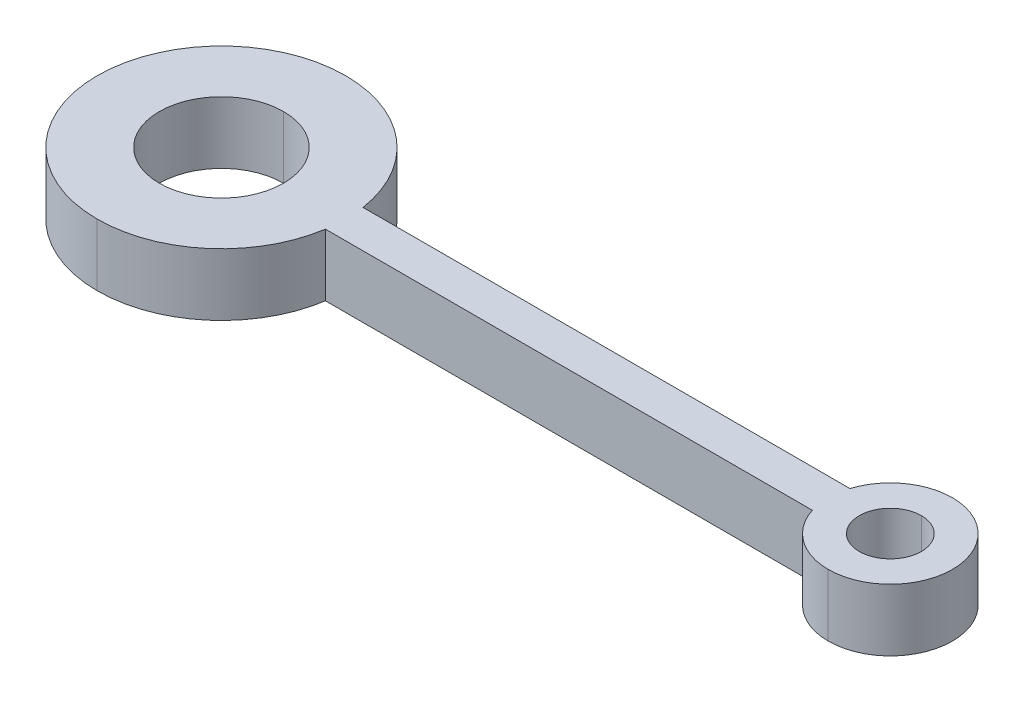
ISO-10303-21;
HEADER;
FILE_DESCRIPTION(('STEP AP214'),'2;1');
FILE_NAME('part.step','',(''),(''),'','','');
FILE_SCHEMA(('AUTOMOTIVE_DESIGN { 1 0 10303 214 1 1 1 1 }'));
ENDSEC;
DATA;
#1=APPLICATION_CONTEXT('core data for automotive mechanical design processes');
#2=APPLICATION_PROTOCOL_DEFINITION('international standard','automotive_design',2000,#1);
#3=PRODUCT_CONTEXT('',#1,'mechanical');
#4=PRODUCT('Part','Part','',(#3));
#5=PRODUCT_RELATED_PRODUCT_CATEGORY('part','',(#4));
#6=PRODUCT_DEFINITION_FORMATION('','',#4);
#7=PRODUCT_DEFINITION_CONTEXT('part definition',#1,'design');
#8=PRODUCT_DEFINITION('design','',#6,#7);
#9=PRODUCT_DEFINITION_SHAPE('','',#8);
#10=(LENGTH_UNIT() NAMED_UNIT(*) SI_UNIT(.MILLI.,.METRE.));
#11=(NAMED_UNIT(*) PLANE_ANGLE_UNIT() SI_UNIT($,.RADIAN.));
#12=(NAMED_UNIT(*) SI_UNIT($,.STERADIAN.) SOLID_ANGLE_UNIT());
#13=UNCERTAINTY_MEASURE_WITH_UNIT(LENGTH_MEASURE(1.E-05),#10,'distance_accuracy_value','');
#14=(GEOMETRIC_REPRESENTATION_CONTEXT(3) GLOBAL_UNCERTAINTY_ASSIGNED_CONTEXT((#13)) GLOBAL_UNIT_ASSIGNED_CONTEXT((#10,
#11,#12)) REPRESENTATION_CONTEXT('',''));
#15=CARTESIAN_POINT('',(0.,0.,0.));
#16=DIRECTION('',(0.,0.,1.));
#17=DIRECTION('',(1.,0.,0.));
#18=AXIS2_PLACEMENT_3D('',#15,#16,#17);
#19=CARTESIAN_POINT('',(121.827839248125,25.,0.));
#20=DIRECTION('',(0.,-1.,0.));
#21=DIRECTION('',(0.,0.,-1.));
#22=AXIS2_PLACEMENT_3D('',#19,#20,#21);
#23=CYLINDRICAL_SURFACE('',#22,25.);
#24=CARTESIAN_POINT('',(121.827839248125,25.,0.));
#25=DIRECTION('',(0.,1.,0.));
#26=DIRECTION('',(0.,0.,1.));
#27=AXIS2_PLACEMENT_3D('',#24,#25,#26);
#28=CIRCLE('',#27,25.);
#29=CARTESIAN_POINT('',(121.827839248125,25.,25.));
#30=VERTEX_POINT('',#29);
#31=CARTESIAN_POINT('',(121.827839248125,25.,-25.));
#32=VERTEX_POINT('',#31);
#33=EDGE_CURVE('E119',#30,#32,#28,.T.);
#34=ORIENTED_EDGE('',*,*,#33,.F.);
#35=DIRECTION('',(0.,-1.,0.));
#36=VECTOR('',#35,1.);
#37=CARTESIAN_POINT('',(121.827839248125,25.,25.));
#38=LINE('',#37,#36);
#39=CARTESIAN_POINT('',(121.827839248125,0.,25.));
#40=VERTEX_POINT('',#39);
#41=EDGE_CURVE('E179',#30,#40,#38,.T.);
#42=ORIENTED_EDGE('',*,*,#41,.T.);
#43=CARTESIAN_POINT('',(121.827839248125,0.,0.));
#44=DIRECTION('',(0.,1.,0.));
#45=DIRECTION('',(0.,0.,1.));
#46=AXIS2_PLACEMENT_3D('',#43,#44,#45);
#47=CIRCLE('',#46,25.);
#48=CARTESIAN_POINT('',(121.827839248125,0.,-25.));
#49=VERTEX_POINT('',#48);
#50=EDGE_CURVE('E122',#40,#49,#47,.T.);
#51=ORIENTED_EDGE('',*,*,#50,.T.);
#52=DIRECTION('',(0.,-1.,0.));
#53=VECTOR('',#52,1.);
#54=CARTESIAN_POINT('',(121.827839248125,25.,-25.));
#55=LINE('',#54,#53);
#56=EDGE_CURVE('E10',#32,#49,#55,.T.);
#57=ORIENTED_EDGE('',*,*,#56,.F.);
#58=EDGE_LOOP('',(#34,#42,#51,#57));
#59=FACE_BOUND('',#58,.T.);
#60=ADVANCED_FACE('F16',(#59),#23,.T.);
#61=CARTESIAN_POINT('',(121.827839248125,25.,0.));
#62=DIRECTION('',(0.,-1.,0.));
#63=DIRECTION('',(0.,0.,-1.));
#64=AXIS2_PLACEMENT_3D('',#61,#62,#63);
#65=CYLINDRICAL_SURFACE('',#64,25.);
#66=CARTESIAN_POINT('',(121.827839248125,25.,0.));
#67=DIRECTION('',(0.,1.,0.));
#68=DIRECTION('',(0.,0.,1.));
#69=AXIS2_PLACEMENT_3D('',#66,#67,#68);
#70=CIRCLE('',#69,25.);
#71=CARTESIAN_POINT('',(98.,25.,-7.56532066508318));
#72=VERTEX_POINT('',#71);
#73=EDGE_CURVE('E127',#32,#72,#70,.T.);
#74=ORIENTED_EDGE('',*,*,#73,.F.);
#75=ORIENTED_EDGE('',*,*,#56,.T.);
#76=CARTESIAN_POINT('',(121.827839248125,0.,0.));
#77=DIRECTION('',(0.,1.,0.));
#78=DIRECTION('',(0.,0.,1.));
#79=AXIS2_PLACEMENT_3D('',#76,#77,#78);
#80=CIRCLE('',#79,25.);
#81=CARTESIAN_POINT('',(98.,0.,-7.56532066508318));
#82=VERTEX_POINT('',#81);
#83=EDGE_CURVE('E163',#49,#82,#80,.T.);
#84=ORIENTED_EDGE('',*,*,#83,.T.);
#85=DIRECTION('',(0.,-1.,0.));
#86=VECTOR('',#85,1.);
#87=CARTESIAN_POINT('',(98.,25.,-7.56532066508318));
#88=LINE('',#87,#86);
#89=EDGE_CURVE('E129',#72,#82,#88,.T.);
#90=ORIENTED_EDGE('',*,*,#89,.F.);
#91=EDGE_LOOP('',(#74,#75,#84,#90));
#92=FACE_BOUND('',#91,.T.);
#93=ADVANCED_FACE('F128',(#92),#65,.T.);
#94=CARTESIAN_POINT('',(121.827839248125,25.,0.));
#95=DIRECTION('',(0.,-1.,0.));
#96=DIRECTION('',(0.,0.,-1.));
#97=AXIS2_PLACEMENT_3D('',#94,#95,#96);
#98=CYLINDRICAL_SURFACE('',#97,12.5);
#99=CARTESIAN_POINT('',(121.827839248125,25.,0.));
#100=DIRECTION('',(0.,1.,0.));
#101=DIRECTION('',(0.,0.,1.));
#102=AXIS2_PLACEMENT_3D('',#99,#100,#101);
#103=CIRCLE('',#102,12.5);
#104=CARTESIAN_POINT('',(121.827839248125,25.,-12.5));
#105=VERTEX_POINT('',#104);
#106=CARTESIAN_POINT('',(121.827839248125,25.,12.5));
#107=VERTEX_POINT('',#106);
#108=EDGE_CURVE('E201',#105,#107,#103,.T.);
#109=ORIENTED_EDGE('',*,*,#108,.T.);
#110=DIRECTION('',(0.,-1.,0.));
#111=VECTOR('',#110,1.);
#112=CARTESIAN_POINT('',(121.827839248125,25.,12.5));
#113=LINE('',#112,#111);
#114=CARTESIAN_POINT('',(121.827839248125,0.,12.5));
#115=VERTEX_POINT('',#114);
#116=EDGE_CURVE('E207',#107,#115,#113,.T.);
#117=ORIENTED_EDGE('',*,*,#116,.T.);
#118=CARTESIAN_POINT('',(121.827839248125,0.,0.));
#119=DIRECTION('',(0.,1.,0.));
#120=DIRECTION('',(0.,0.,1.));
#121=AXIS2_PLACEMENT_3D('',#118,#119,#120);
#122=CIRCLE('',#121,12.5);
#123=CARTESIAN_POINT('',(121.827839248125,0.,-12.5));
#124=VERTEX_POINT('',#123);
#125=EDGE_CURVE('E186',#124,#115,#122,.T.);
#126=ORIENTED_EDGE('',*,*,#125,.F.);
#127=DIRECTION('',(0.,-1.,0.));
#128=VECTOR('',#127,1.);
#129=CARTESIAN_POINT('',(121.827839248125,25.,-12.5));
#130=LINE('',#129,#128);
#131=EDGE_CURVE('E182',#105,#124,#130,.T.);
#132=ORIENTED_EDGE('',*,*,#131,.F.);
#133=EDGE_LOOP('',(#109,#117,#126,#132));
#134=FACE_BOUND('',#133,.T.);
#135=ADVANCED_FACE('F312',(#134),#98,.F.);
#136=CARTESIAN_POINT('',(-147.424345450743,25.,0.));
#137=DIRECTION('',(0.,-1.,0.));
#138=DIRECTION('',(0.,0.,-1.));
#139=AXIS2_PLACEMENT_3D('',#136,#137,#138);
#140=CYLINDRICAL_SURFACE('',#139,50.);
#141=CARTESIAN_POINT('',(-147.424345450743,25.,0.));
#142=DIRECTION('',(0.,1.,0.));
#143=DIRECTION('',(0.,0.,1.));
#144=AXIS2_PLACEMENT_3D('',#141,#142,#143);
#145=CIRCLE('',#144,50.);
#146=CARTESIAN_POINT('',(-147.424345450743,25.,50.));
#147=VERTEX_POINT('',#146);
#148=CARTESIAN_POINT('',(-98.,25.,7.56532066508318));
#149=VERTEX_POINT('',#148);
#150=EDGE_CURVE('E185',#147,#149,#145,.T.);
#151=ORIENTED_EDGE('',*,*,#150,.F.);
#152=DIRECTION('',(0.,-1.,0.));
#153=VECTOR('',#152,1.);
#154=CARTESIAN_POINT('',(-147.424345450743,25.,50.));
#155=LINE('',#154,#153);
#156=CARTESIAN_POINT('',(-147.424345450743,0.,50.));
#157=VERTEX_POINT('',#156);
#158=EDGE_CURVE('E27',#147,#157,#155,.T.);
#159=ORIENTED_EDGE('',*,*,#158,.T.);
#160=CARTESIAN_POINT('',(-147.424345450743,0.,0.));
#161=DIRECTION('',(0.,1.,0.));
#162=DIRECTION('',(0.,0.,1.));
#163=AXIS2_PLACEMENT_3D('',#160,#161,#162);
#164=CIRCLE('',#163,50.);
#165=CARTESIAN_POINT('',(-98.,0.,7.56532066508318));
#166=VERTEX_POINT('',#165);
#167=EDGE_CURVE('E176',#157,#166,#164,.T.);
#168=ORIENTED_EDGE('',*,*,#167,.T.);
#169=DIRECTION('',(0.,-1.,0.));
#170=VECTOR('',#169,1.);
#171=CARTESIAN_POINT('',(-98.,25.,7.56532066508318));
#172=LINE('',#171,#170);
#173=EDGE_CURVE('E236',#149,#166,#172,.T.);
#174=ORIENTED_EDGE('',*,*,#173,.F.);
#175=EDGE_LOOP('',(#151,#159,#168,#174));
#176=FACE_BOUND('',#175,.T.);
#177=ADVANCED_FACE('F272',(#176),#140,.T.);
#178=CARTESIAN_POINT('',(-147.424345450743,25.,0.));
#179=DIRECTION('',(0.,-1.,0.));
#180=DIRECTION('',(0.,0.,-1.));
#181=AXIS2_PLACEMENT_3D('',#178,#179,#180);
#182=CYLINDRICAL_SURFACE('',#181,50.);
#183=ORIENTED_EDGE('',*,*,#158,.F.);
#184=CARTESIAN_POINT('',(-147.424345450743,25.,0.));
#185=DIRECTION('',(0.,1.,0.));
#186=DIRECTION('',(0.,0.,1.));
#187=AXIS2_PLACEMENT_3D('',#184,#185,#186);
#188=CIRCLE('',#187,50.);
#189=CARTESIAN_POINT('',(-147.424345450743,25.,-50.));
#190=VERTEX_POINT('',#189);
#191=EDGE_CURVE('E215',#190,#147,#188,.T.);
#192=ORIENTED_EDGE('',*,*,#191,.F.);
#193=DIRECTION('',(0.,-1.,0.));
#194=VECTOR('',#193,1.);
#195=CARTESIAN_POINT('',(-147.424345450743,25.,-50.));
#196=LINE('',#195,#194);
#197=CARTESIAN_POINT('',(-147.424345450743,0.,-50.));
#198=VERTEX_POINT('',#197);
#199=EDGE_CURVE('E195',#190,#198,#196,.T.);
#200=ORIENTED_EDGE('',*,*,#199,.T.);
#201=CARTESIAN_POINT('',(-147.424345450743,0.,0.));
#202=DIRECTION('',(0.,1.,0.));
#203=DIRECTION('',(0.,0.,1.));
#204=AXIS2_PLACEMENT_3D('',#201,#202,#203);
#205=CIRCLE('',#204,50.);
#206=EDGE_CURVE('E190',#198,#157,#205,.T.);
#207=ORIENTED_EDGE('',*,*,#206,.T.);
#208=EDGE_LOOP('',(#183,#192,#200,#207));
#209=FACE_BOUND('',#208,.T.);
#210=ADVANCED_FACE('F18',(#209),#182,.T.);
#211=CARTESIAN_POINT('',(-147.424345450743,25.,0.));
#212=DIRECTION('',(0.,-1.,0.));
#213=DIRECTION('',(0.,0.,-1.));
#214=AXIS2_PLACEMENT_3D('',#211,#212,#213);
#215=CYLINDRICAL_SURFACE('',#214,25.);
#216=CARTESIAN_POINT('',(-147.424345450743,25.,0.));
#217=DIRECTION('',(0.,1.,0.));
#218=DIRECTION('',(0.,0.,1.));
#219=AXIS2_PLACEMENT_3D('',#216,#217,#218);
#220=CIRCLE('',#219,25.);
#221=CARTESIAN_POINT('',(-147.424345450743,25.,-25.));
#222=VERTEX_POINT('',#221);
#223=CARTESIAN_POINT('',(-147.424345450743,25.,25.));
#224=VERTEX_POINT('',#223);
#225=EDGE_CURVE('E243',#222,#224,#220,.T.);
#226=ORIENTED_EDGE('',*,*,#225,.T.);
#227=DIRECTION('',(0.,-1.,0.));
#228=VECTOR('',#227,1.);
#229=CARTESIAN_POINT('',(-147.424345450743,25.,25.));
#230=LINE('',#229,#228);
#231=CARTESIAN_POINT('',(-147.424345450743,0.,25.));
#232=VERTEX_POINT('',#231);
#233=EDGE_CURVE('E42',#224,#232,#230,.T.);
#234=ORIENTED_EDGE('',*,*,#233,.T.);
#235=CARTESIAN_POINT('',(-147.424345450743,0.,0.));
#236=DIRECTION('',(0.,1.,0.));
#237=DIRECTION('',(0.,0.,1.));
#238=AXIS2_PLACEMENT_3D('',#235,#236,#237);
#239=CIRCLE('',#238,25.);
#240=CARTESIAN_POINT('',(-147.424345450743,0.,-25.));
#241=VERTEX_POINT('',#240);
#242=EDGE_CURVE('E154',#241,#232,#239,.T.);
#243=ORIENTED_EDGE('',*,*,#242,.F.);
#244=DIRECTION('',(0.,-1.,0.));
#245=VECTOR('',#244,1.);
#246=CARTESIAN_POINT('',(-147.424345450743,25.,-25.));
#247=LINE('',#246,#245);
#248=EDGE_CURVE('E152',#222,#241,#247,.T.);
#249=ORIENTED_EDGE('',*,*,#248,.F.);
#250=EDGE_LOOP('',(#226,#234,#243,#249));
#251=FACE_BOUND('',#250,.T.);
#252=ADVANCED_FACE('F344',(#251),#215,.F.);
#253=CARTESIAN_POINT('',(0.,25.,-7.56532066508318));
#254=DIRECTION('',(0.,0.,-1.));
#255=DIRECTION('',(0.,-1.,0.));
#256=AXIS2_PLACEMENT_3D('',#253,#254,#255);
#257=PLANE('',#256);
#258=DIRECTION('',(1.,0.,0.));
#259=VECTOR('',#258,1.);
#260=CARTESIAN_POINT('',(0.,0.,-7.56532066508318));
#261=LINE('',#260,#259);
#262=CARTESIAN_POINT('',(-98.,0.,-7.56532066508318));
#263=VERTEX_POINT('',#262);
#264=EDGE_CURVE('E20',#263,#82,#261,.T.);
#265=ORIENTED_EDGE('',*,*,#264,.F.);
#266=DIRECTION('',(0.,-1.,0.));
#267=VECTOR('',#266,1.);
#268=CARTESIAN_POINT('',(-98.,25.,-7.56532066508318));
#269=LINE('',#268,#267);
#270=CARTESIAN_POINT('',(-98.,25.,-7.56532066508318));
#271=VERTEX_POINT('',#270);
#272=EDGE_CURVE('E168',#271,#263,#269,.T.);
#273=ORIENTED_EDGE('',*,*,#272,.F.);
#274=DIRECTION('',(1.,0.,0.));
#275=VECTOR('',#274,1.);
#276=CARTESIAN_POINT('',(0.,25.,-7.56532066508318));
#277=LINE('',#276,#275);
#278=EDGE_CURVE('E134',#271,#72,#277,.T.);
#279=ORIENTED_EDGE('',*,*,#278,.T.);
#280=ORIENTED_EDGE('',*,*,#89,.T.);
#281=EDGE_LOOP('',(#265,#273,#279,#280));
#282=FACE_BOUND('',#281,.T.);
#283=ADVANCED_FACE('F349',(#282),#257,.T.);
#284=CARTESIAN_POINT('',(121.827839248125,25.,0.));
#285=DIRECTION('',(0.,-1.,0.));
#286=DIRECTION('',(0.,0.,-1.));
#287=AXIS2_PLACEMENT_3D('',#284,#285,#286);
#288=CYLINDRICAL_SURFACE('',#287,25.);
#289=ORIENTED_EDGE('',*,*,#41,.F.);
#290=CARTESIAN_POINT('',(121.827839248125,25.,0.));
#291=DIRECTION('',(0.,1.,0.));
#292=DIRECTION('',(0.,0.,1.));
#293=AXIS2_PLACEMENT_3D('',#290,#291,#292);
#294=CIRCLE('',#293,25.);
#295=CARTESIAN_POINT('',(98.,25.,7.56532066508318));
#296=VERTEX_POINT('',#295);
#297=EDGE_CURVE('E140',#296,#30,#294,.T.);
#298=ORIENTED_EDGE('',*,*,#297,.F.);
#299=DIRECTION('',(0.,-1.,0.));
#300=VECTOR('',#299,1.);
#301=CARTESIAN_POINT('',(98.,25.,7.56532066508318));
#302=LINE('',#301,#300);
#303=CARTESIAN_POINT('',(98.,0.,7.56532066508318));
#304=VERTEX_POINT('',#303);
#305=EDGE_CURVE('E234',#296,#304,#302,.T.);
#306=ORIENTED_EDGE('',*,*,#305,.T.);
#307=CARTESIAN_POINT('',(121.827839248125,0.,0.));
#308=DIRECTION('',(0.,1.,0.));
#309=DIRECTION('',(0.,0.,1.));
#310=AXIS2_PLACEMENT_3D('',#307,#308,#309);
#311=CIRCLE('',#310,25.);
#312=EDGE_CURVE('E177',#304,#40,#311,.T.);
#313=ORIENTED_EDGE('',*,*,#312,.T.);
#314=EDGE_LOOP('',(#289,#298,#306,#313));
#315=FACE_BOUND('',#314,.T.);
#316=ADVANCED_FACE('F283',(#315),#288,.T.);
#317=CARTESIAN_POINT('',(121.827839248125,25.,0.));
#318=DIRECTION('',(0.,-1.,0.));
#319=DIRECTION('',(0.,0.,-1.));
#320=AXIS2_PLACEMENT_3D('',#317,#318,#319);
#321=CYLINDRICAL_SURFACE('',#320,12.5);
#322=ORIENTED_EDGE('',*,*,#116,.F.);
#323=CARTESIAN_POINT('',(121.827839248125,25.,0.));
#324=DIRECTION('',(0.,1.,0.));
#325=DIRECTION('',(0.,0.,1.));
#326=AXIS2_PLACEMENT_3D('',#323,#324,#325);
#327=CIRCLE('',#326,12.5);
#328=EDGE_CURVE('E232',#107,#105,#327,.T.);
#329=ORIENTED_EDGE('',*,*,#328,.T.);
#330=ORIENTED_EDGE('',*,*,#131,.T.);
#331=CARTESIAN_POINT('',(121.827839248125,0.,0.));
#332=DIRECTION('',(0.,1.,0.));
#333=DIRECTION('',(0.,0.,1.));
#334=AXIS2_PLACEMENT_3D('',#331,#332,#333);
#335=CIRCLE('',#334,12.5);
#336=EDGE_CURVE('E158',#115,#124,#335,.T.);
#337=ORIENTED_EDGE('',*,*,#336,.F.);
#338=EDGE_LOOP('',(#322,#329,#330,#337));
#339=FACE_BOUND('',#338,.T.);
#340=ADVANCED_FACE('F380',(#339),#321,.F.);
#341=CARTESIAN_POINT('',(0.,25.,7.56532066508318));
#342=DIRECTION('',(0.,0.,-1.));
#343=DIRECTION('',(-1.,0.,0.));
#344=AXIS2_PLACEMENT_3D('',#341,#342,#343);
#345=PLANE('',#344);
#346=DIRECTION('',(1.,0.,0.));
#347=VECTOR('',#346,1.);
#348=CARTESIAN_POINT('',(0.,0.,7.56532066508318));
#349=LINE('',#348,#347);
#350=EDGE_CURVE('E173',#166,#304,#349,.T.);
#351=ORIENTED_EDGE('',*,*,#350,.T.);
#352=ORIENTED_EDGE('',*,*,#305,.F.);
#353=DIRECTION('',(1.,0.,0.));
#354=VECTOR('',#353,1.);
#355=CARTESIAN_POINT('',(0.,25.,7.56532066508318));
#356=LINE('',#355,#354);
#357=EDGE_CURVE('E148',#149,#296,#356,.T.);
#358=ORIENTED_EDGE('',*,*,#357,.F.);
#359=ORIENTED_EDGE('',*,*,#173,.T.);
#360=EDGE_LOOP('',(#351,#352,#358,#359));
#361=FACE_BOUND('',#360,.T.);
#362=ADVANCED_FACE('F281',(#361),#345,.F.);
#363=CARTESIAN_POINT('',(-147.424345450743,25.,0.));
#364=DIRECTION('',(0.,-1.,0.));
#365=DIRECTION('',(0.,0.,-1.));
#366=AXIS2_PLACEMENT_3D('',#363,#364,#365);
#367=CYLINDRICAL_SURFACE('',#366,25.);
#368=ORIENTED_EDGE('',*,*,#233,.F.);
#369=CARTESIAN_POINT('',(-147.424345450743,25.,0.));
#370=DIRECTION('',(0.,1.,0.));
#371=DIRECTION('',(0.,0.,1.));
#372=AXIS2_PLACEMENT_3D('',#369,#370,#371);
#373=CIRCLE('',#372,25.);
#374=EDGE_CURVE('E212',#224,#222,#373,.T.);
#375=ORIENTED_EDGE('',*,*,#374,.T.);
#376=ORIENTED_EDGE('',*,*,#248,.T.);
#377=CARTESIAN_POINT('',(-147.424345450743,0.,0.));
#378=DIRECTION('',(0.,1.,0.));
#379=DIRECTION('',(0.,0.,1.));
#380=AXIS2_PLACEMENT_3D('',#377,#378,#379);
#381=CIRCLE('',#380,25.);
#382=EDGE_CURVE('E157',#232,#241,#381,.T.);
#383=ORIENTED_EDGE('',*,*,#382,.F.);
#384=EDGE_LOOP('',(#368,#375,#376,#383));
#385=FACE_BOUND('',#384,.T.);
#386=ADVANCED_FACE('F368',(#385),#367,.F.);
#387=CARTESIAN_POINT('',(-147.424345450743,25.,0.));
#388=DIRECTION('',(0.,-1.,0.));
#389=DIRECTION('',(0.,0.,-1.));
#390=AXIS2_PLACEMENT_3D('',#387,#388,#389);
#391=CYLINDRICAL_SURFACE('',#390,50.);
#392=ORIENTED_EDGE('',*,*,#199,.F.);
#393=CARTESIAN_POINT('',(-147.424345450743,25.,0.));
#394=DIRECTION('',(0.,1.,0.));
#395=DIRECTION('',(0.,0.,1.));
#396=AXIS2_PLACEMENT_3D('',#393,#394,#395);
#397=CIRCLE('',#396,50.);
#398=EDGE_CURVE('E162',#271,#190,#397,.T.);
#399=ORIENTED_EDGE('',*,*,#398,.F.);
#400=ORIENTED_EDGE('',*,*,#272,.T.);
#401=CARTESIAN_POINT('',(-147.424345450743,0.,0.));
#402=DIRECTION('',(0.,1.,0.));
#403=DIRECTION('',(0.,0.,1.));
#404=AXIS2_PLACEMENT_3D('',#401,#402,#403);
#405=CIRCLE('',#404,50.);
#406=EDGE_CURVE('E169',#263,#198,#405,.T.);
#407=ORIENTED_EDGE('',*,*,#406,.T.);
#408=EDGE_LOOP('',(#392,#399,#400,#407));
#409=FACE_BOUND('',#408,.T.);
#410=ADVANCED_FACE('F334',(#409),#391,.T.);
#411=CARTESIAN_POINT('',(0.,25.,0.));
#412=DIRECTION('',(0.,1.,0.));
#413=DIRECTION('',(1.,0.,0.));
#414=AXIS2_PLACEMENT_3D('',#411,#412,#413);
#415=PLANE('',#414);
#416=ORIENTED_EDGE('',*,*,#225,.F.);
#417=ORIENTED_EDGE('',*,*,#374,.F.);
#418=EDGE_LOOP('',(#416,#417));
#419=FACE_BOUND('',#418,.T.);
#420=ORIENTED_EDGE('',*,*,#108,.F.);
#421=ORIENTED_EDGE('',*,*,#328,.F.);
#422=EDGE_LOOP('',(#420,#421));
#423=FACE_BOUND('',#422,.T.);
#424=ORIENTED_EDGE('',*,*,#398,.T.);
#425=ORIENTED_EDGE('',*,*,#191,.T.);
#426=ORIENTED_EDGE('',*,*,#150,.T.);
#427=ORIENTED_EDGE('',*,*,#357,.T.);
#428=ORIENTED_EDGE('',*,*,#297,.T.);
#429=ORIENTED_EDGE('',*,*,#33,.T.);
#430=ORIENTED_EDGE('',*,*,#73,.T.);
#431=ORIENTED_EDGE('',*,*,#278,.F.);
#432=EDGE_LOOP('',(#424,#425,#426,#427,#428,#429,#430,#431));
#433=FACE_BOUND('',#432,.T.);
#434=ADVANCED_FACE('F137',(#419,#423,#433),#415,.T.);
#435=CARTESIAN_POINT('',(0.,0.,0.));
#436=DIRECTION('',(0.,1.,0.));
#437=DIRECTION('',(1.,0.,0.));
#438=AXIS2_PLACEMENT_3D('',#435,#436,#437);
#439=PLANE('',#438);
#440=ORIENTED_EDGE('',*,*,#242,.T.);
#441=ORIENTED_EDGE('',*,*,#382,.T.);
#442=EDGE_LOOP('',(#440,#441));
#443=FACE_BOUND('',#442,.T.);
#444=ORIENTED_EDGE('',*,*,#125,.T.);
#445=ORIENTED_EDGE('',*,*,#336,.T.);
#446=EDGE_LOOP('',(#444,#445));
#447=FACE_BOUND('',#446,.T.);
#448=ORIENTED_EDGE('',*,*,#406,.F.);
#449=ORIENTED_EDGE('',*,*,#264,.T.);
#450=ORIENTED_EDGE('',*,*,#83,.F.);
#451=ORIENTED_EDGE('',*,*,#50,.F.);
#452=ORIENTED_EDGE('',*,*,#312,.F.);
#453=ORIENTED_EDGE('',*,*,#350,.F.);
#454=ORIENTED_EDGE('',*,*,#167,.F.);
#455=ORIENTED_EDGE('',*,*,#206,.F.);
#456=EDGE_LOOP('',(#448,#449,#450,#451,#452,#453,#454,#455));
#457=FACE_BOUND('',#456,.T.);
#458=ADVANCED_FACE('F280',(#443,#447,#457),#439,.F.);
#459=CLOSED_SHELL('',(#60,#93,#135,#177,#210,#252,#283,#316,#340,#362,#386,#410,#434,#458));
#460=MANIFOLD_SOLID_BREP('B1',#459);
#461=ADVANCED_BREP_SHAPE_REPRESENTATION('',(#18,#460),#14);
#462=SHAPE_DEFINITION_REPRESENTATION(#9,#461);
ENDSEC;
END-ISO-10303-21;
